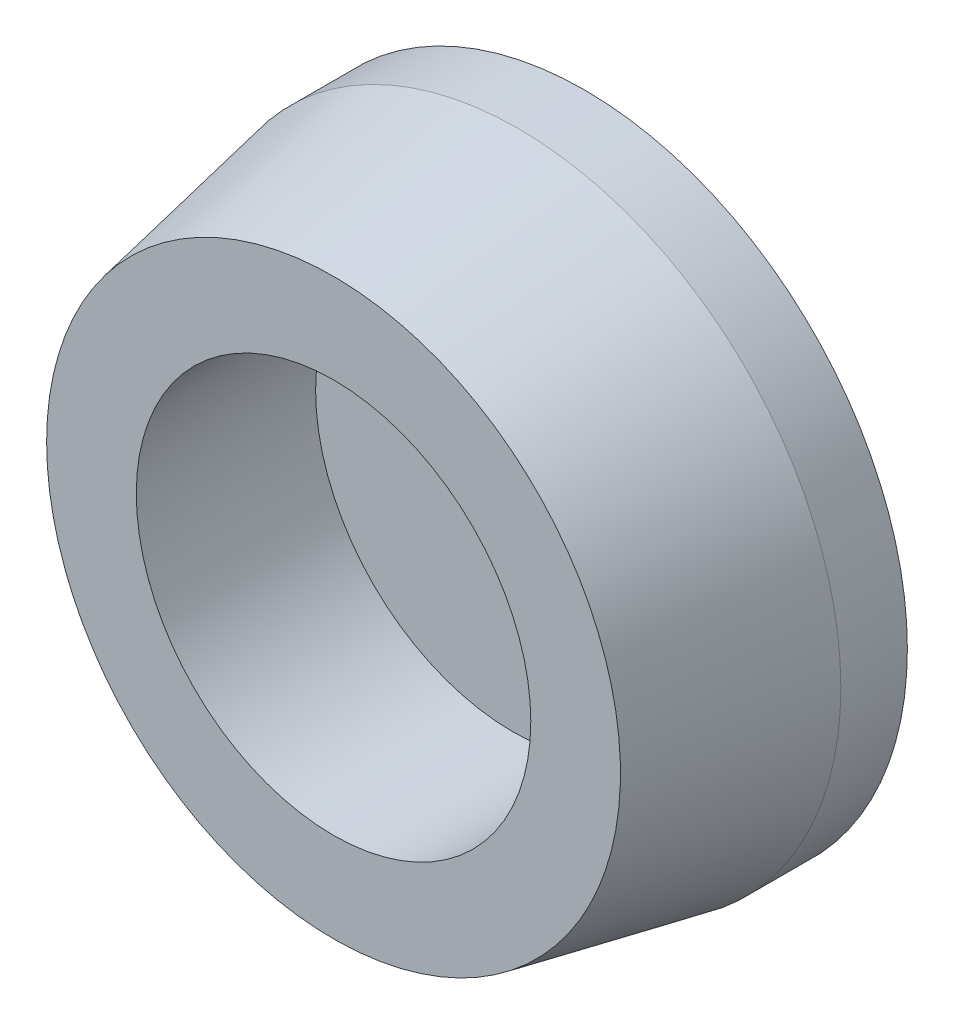
ISO-10303-21;
HEADER;
FILE_DESCRIPTION(('STEP AP214'),'2;1');
FILE_NAME('part.step','',(''),(''),'','','');
FILE_SCHEMA(('AUTOMOTIVE_DESIGN { 1 0 10303 214 1 1 1 1 }'));
ENDSEC;
DATA;
#1=APPLICATION_CONTEXT('core data for automotive mechanical design processes');
#2=APPLICATION_PROTOCOL_DEFINITION('international standard','automotive_design',2000,#1);
#3=PRODUCT_CONTEXT('',#1,'mechanical');
#4=PRODUCT('Part','Part','',(#3));
#5=PRODUCT_RELATED_PRODUCT_CATEGORY('part','',(#4));
#6=PRODUCT_DEFINITION_FORMATION('','',#4);
#7=PRODUCT_DEFINITION_CONTEXT('part definition',#1,'design');
#8=PRODUCT_DEFINITION('design','',#6,#7);
#9=PRODUCT_DEFINITION_SHAPE('','',#8);
#10=(LENGTH_UNIT() NAMED_UNIT(*) SI_UNIT(.MILLI.,.METRE.));
#11=(NAMED_UNIT(*) PLANE_ANGLE_UNIT() SI_UNIT($,.RADIAN.));
#12=(NAMED_UNIT(*) SI_UNIT($,.STERADIAN.) SOLID_ANGLE_UNIT());
#13=UNCERTAINTY_MEASURE_WITH_UNIT(LENGTH_MEASURE(1.E-05),#10,'distance_accuracy_value','');
#14=(GEOMETRIC_REPRESENTATION_CONTEXT(3) GLOBAL_UNCERTAINTY_ASSIGNED_CONTEXT((#13)) GLOBAL_UNIT_ASSIGNED_CONTEXT((#10,
#11,#12)) REPRESENTATION_CONTEXT('',''));
#15=CARTESIAN_POINT('',(0.,0.,0.));
#16=DIRECTION('',(0.,0.,1.));
#17=DIRECTION('',(1.,0.,0.));
#18=AXIS2_PLACEMENT_3D('',#15,#16,#17);
#19=CARTESIAN_POINT('',(0.,0.,7.));
#20=DIRECTION('',(0.,0.,-1.));
#21=DIRECTION('',(-1.,0.,0.));
#22=AXIS2_PLACEMENT_3D('',#19,#20,#21);
#23=CYLINDRICAL_SURFACE('',#22,9.);
#24=CARTESIAN_POINT('',(0.,0.,1.85544598402974));
#25=DIRECTION('',(0.,0.,1.));
#26=DIRECTION('',(1.,0.,0.));
#27=AXIS2_PLACEMENT_3D('',#24,#25,#26);
#28=CIRCLE('',#27,9.);
#29=CARTESIAN_POINT('',(-9.,0.,1.85544598402974));
#30=VERTEX_POINT('',#29);
#31=EDGE_CURVE('E10',#30,#30,#28,.F.);
#32=ORIENTED_EDGE('',*,*,#31,.T.);
#33=EDGE_LOOP('',(#32));
#34=FACE_BOUND('',#33,.T.);
#35=CARTESIAN_POINT('',(0.,0.,0.));
#36=DIRECTION('',(0.,0.,1.));
#37=DIRECTION('',(1.,0.,0.));
#38=AXIS2_PLACEMENT_3D('',#35,#36,#37);
#39=CIRCLE('',#38,9.);
#40=CARTESIAN_POINT('',(9.,0.,0.));
#41=VERTEX_POINT('',#40);
#42=EDGE_CURVE('E48',#41,#41,#39,.T.);
#43=ORIENTED_EDGE('',*,*,#42,.T.);
#44=EDGE_LOOP('',(#43));
#45=FACE_BOUND('',#44,.T.);
#46=ADVANCED_FACE('F36',(#34,#45),#23,.T.);
#47=CARTESIAN_POINT('',(0.,0.,7.));
#48=DIRECTION('',(0.,0.,1.));
#49=DIRECTION('',(1.,0.,0.));
#50=AXIS2_PLACEMENT_3D('',#47,#48,#49);
#51=PLANE('',#50);
#52=CARTESIAN_POINT('',(0.,0.,7.));
#53=DIRECTION('',(0.,0.,1.));
#54=DIRECTION('',(1.,0.,0.));
#55=AXIS2_PLACEMENT_3D('',#52,#53,#54);
#56=CIRCLE('',#55,8.);
#57=CARTESIAN_POINT('',(-8.,0.,7.));
#58=VERTEX_POINT('',#57);
#59=EDGE_CURVE('E44',#58,#58,#56,.T.);
#60=ORIENTED_EDGE('',*,*,#59,.T.);
#61=EDGE_LOOP('',(#60));
#62=FACE_BOUND('',#61,.T.);
#63=CARTESIAN_POINT('',(0.,0.,7.));
#64=DIRECTION('',(0.,0.,1.));
#65=DIRECTION('',(1.,0.,0.));
#66=AXIS2_PLACEMENT_3D('',#63,#64,#65);
#67=CIRCLE('',#66,5.5);
#68=CARTESIAN_POINT('',(5.5,0.,7.));
#69=VERTEX_POINT('',#68);
#70=EDGE_CURVE('E55',#69,#69,#67,.T.);
#71=ORIENTED_EDGE('',*,*,#70,.F.);
#72=EDGE_LOOP('',(#71));
#73=FACE_BOUND('',#72,.T.);
#74=ADVANCED_FACE('F70',(#62,#73),#51,.T.);
#75=CARTESIAN_POINT('',(0.,0.,0.));
#76=DIRECTION('',(0.,0.,1.));
#77=DIRECTION('',(1.,0.,0.));
#78=AXIS2_PLACEMENT_3D('',#75,#76,#77);
#79=PLANE('',#78);
#80=ORIENTED_EDGE('',*,*,#42,.F.);
#81=EDGE_LOOP('',(#80));
#82=FACE_BOUND('',#81,.T.);
#83=ADVANCED_FACE('F66',(#82),#79,.F.);
#84=CARTESIAN_POINT('',(0.,0.,2.));
#85=DIRECTION('',(0.,0.,1.));
#86=DIRECTION('',(1.,0.,0.));
#87=AXIS2_PLACEMENT_3D('',#84,#85,#86);
#88=CYLINDRICAL_SURFACE('',#87,5.5);
#89=CARTESIAN_POINT('',(0.,0.,2.));
#90=DIRECTION('',(0.,0.,1.));
#91=DIRECTION('',(1.,0.,0.));
#92=AXIS2_PLACEMENT_3D('',#89,#90,#91);
#93=CIRCLE('',#92,5.5);
#94=CARTESIAN_POINT('',(5.5,0.,2.));
#95=VERTEX_POINT('',#94);
#96=EDGE_CURVE('E52',#95,#95,#93,.T.);
#97=ORIENTED_EDGE('',*,*,#96,.F.);
#98=EDGE_LOOP('',(#97));
#99=FACE_BOUND('',#98,.T.);
#100=ORIENTED_EDGE('',*,*,#70,.T.);
#101=EDGE_LOOP('',(#100));
#102=FACE_BOUND('',#101,.T.);
#103=ADVANCED_FACE('F63',(#99,#102),#88,.F.);
#104=CARTESIAN_POINT('',(0.,0.,2.));
#105=DIRECTION('',(0.,0.,1.));
#106=DIRECTION('',(1.,0.,0.));
#107=AXIS2_PLACEMENT_3D('',#104,#105,#106);
#108=PLANE('',#107);
#109=ORIENTED_EDGE('',*,*,#96,.T.);
#110=EDGE_LOOP('',(#109));
#111=FACE_BOUND('',#110,.T.);
#112=ADVANCED_FACE('F61',(#111),#108,.T.);
#113=CARTESIAN_POINT('',(0.,0.,7.));
#114=DIRECTION('',(0.,0.,-1.));
#115=DIRECTION('',(-1.,0.,0.));
#116=AXIS2_PLACEMENT_3D('',#113,#114,#115);
#117=CONICAL_SURFACE('',#116,8.,0.191986217719377);
#118=CARTESIAN_POINT('',(-9.,0.,1.85544598402974));
#119=CARTESIAN_POINT('',(-8.98958333333333,0.,1.90903508836276));
#120=CARTESIAN_POINT('',(-8.97916666666667,0.,1.96262419269578));
#121=CARTESIAN_POINT('',(-8.95833333333333,0.,2.06980240136183));
#122=CARTESIAN_POINT('',(-8.94791666666667,0.,2.12339150569486));
#123=CARTESIAN_POINT('',(-8.92708333333333,0.,2.2305697143609));
#124=CARTESIAN_POINT('',(-8.91666666666666,0.,2.28415881869393));
#125=CARTESIAN_POINT('',(-8.89583333333333,0.,2.39133702735997));
#126=CARTESIAN_POINT('',(-8.88541666666667,0.,2.444926131693));
#127=CARTESIAN_POINT('',(-8.86458333333334,0.,2.55210434035904));
#128=CARTESIAN_POINT('',(-8.85416666666667,0.,2.60569344469207));
#129=CARTESIAN_POINT('',(-8.83333333333333,0.,2.71287165335811));
#130=CARTESIAN_POINT('',(-8.82291666666667,0.,2.76646075769114));
#131=CARTESIAN_POINT('',(-8.80208333333333,0.,2.87363896635718));
#132=CARTESIAN_POINT('',(-8.79166666666667,0.,2.92722807069021));
#133=CARTESIAN_POINT('',(-8.77083333333333,0.,3.03440627935626));
#134=CARTESIAN_POINT('',(-8.76041666666667,0.,3.08799538368928));
#135=CARTESIAN_POINT('',(-8.73958333333333,0.,3.19517359235533));
#136=CARTESIAN_POINT('',(-8.72916666666667,0.,3.24876269668835));
#137=CARTESIAN_POINT('',(-8.70833333333333,0.,3.3559409053544));
#138=CARTESIAN_POINT('',(-8.69791666666667,0.,3.40953000968742));
#139=CARTESIAN_POINT('',(-8.67708333333333,0.,3.51670821835347));
#140=CARTESIAN_POINT('',(-8.66666666666667,0.,3.57029732268649));
#141=CARTESIAN_POINT('',(-8.64583333333333,0.,3.67747553135254));
#142=CARTESIAN_POINT('',(-8.63541666666667,0.,3.73106463568556));
#143=CARTESIAN_POINT('',(-8.61458333333333,0.,3.83824284435161));
#144=CARTESIAN_POINT('',(-8.60416666666667,0.,3.89183194868463));
#145=CARTESIAN_POINT('',(-8.58333333333333,0.,3.99901015735068));
#146=CARTESIAN_POINT('',(-8.57291666666667,0.,4.0525992616837));
#147=CARTESIAN_POINT('',(-8.55208333333333,0.,4.15977747034975));
#148=CARTESIAN_POINT('',(-8.54166666666667,0.,4.21336657468277));
#149=CARTESIAN_POINT('',(-8.52083333333334,0.,4.32054478334882));
#150=CARTESIAN_POINT('',(-8.51041666666667,0.,4.37413388768184));
#151=CARTESIAN_POINT('',(-8.48958333333334,0.,4.48131209634789));
#152=CARTESIAN_POINT('',(-8.47916666666667,0.,4.53490120068092));
#153=CARTESIAN_POINT('',(-8.45833333333334,0.,4.64207940934696));
#154=CARTESIAN_POINT('',(-8.44791666666667,0.,4.69566851367999));
#155=CARTESIAN_POINT('',(-8.42708333333334,0.,4.80284672234603));
#156=CARTESIAN_POINT('',(-8.41666666666667,0.,4.85643582667906));
#157=CARTESIAN_POINT('',(-8.39583333333334,0.,4.9636140353451));
#158=CARTESIAN_POINT('',(-8.38541666666667,0.,5.01720313967813));
#159=CARTESIAN_POINT('',(-8.36458333333334,0.,5.12438134834417));
#160=CARTESIAN_POINT('',(-8.35416666666667,0.,5.1779704526772));
#161=CARTESIAN_POINT('',(-8.33333333333334,0.,5.28514866134325));
#162=CARTESIAN_POINT('',(-8.32291666666667,0.,5.33873776567627));
#163=CARTESIAN_POINT('',(-8.30208333333334,0.,5.44591597434232));
#164=CARTESIAN_POINT('',(-8.29166666666667,0.,5.49950507867534));
#165=CARTESIAN_POINT('',(-8.27083333333334,0.,5.60668328734139));
#166=CARTESIAN_POINT('',(-8.26041666666667,0.,5.66027239167441));
#167=CARTESIAN_POINT('',(-8.23958333333334,0.,5.76745060034046));
#168=CARTESIAN_POINT('',(-8.22916666666667,0.,5.82103970467348));
#169=CARTESIAN_POINT('',(-8.20833333333334,0.,5.92821791333953));
#170=CARTESIAN_POINT('',(-8.19791666666667,0.,5.98180701767255));
#171=CARTESIAN_POINT('',(-8.17708333333334,0.,6.0889852263386));
#172=CARTESIAN_POINT('',(-8.16666666666667,0.,6.14257433067162));
#173=CARTESIAN_POINT('',(-8.14583333333334,0.,6.24975253933767));
#174=CARTESIAN_POINT('',(-8.13541666666667,0.,6.30334164367069));
#175=CARTESIAN_POINT('',(-8.11458333333334,0.,6.41051985233674));
#176=CARTESIAN_POINT('',(-8.10416666666667,0.,6.46410895666976));
#177=CARTESIAN_POINT('',(-8.08333333333334,0.,6.57128716533581));
#178=CARTESIAN_POINT('',(-8.07291666666667,0.,6.62487626966884));
#179=CARTESIAN_POINT('',(-8.05208333333334,0.,6.73205447833488));
#180=CARTESIAN_POINT('',(-8.04166666666667,0.,6.78564358266791));
#181=CARTESIAN_POINT('',(-8.02083333333334,0.,6.89282179133395));
#182=CARTESIAN_POINT('',(-8.01041666666667,0.,6.94641089566698));
#183=CARTESIAN_POINT('',(-8.,0.,7.));
#184=B_SPLINE_CURVE_WITH_KNOTS('',3,(#118,#119,#120,#121,#122,#123,#124,#125,#126,#127,#128,
#129,#130,#131,#132,#133,#134,#135,#136,#137,#138,#139,#140,#141,#142,#143,#144,#145,#146,#147,
#148,#149,#150,#151,#152,#153,#154,#155,#156,#157,#158,#159,#160,#161,#162,#163,#164,#165,#166,
#167,#168,#169,#170,#171,#172,#173,#174,#175,#176,#177,#178,#179,#180,#181,#182,#183),
.UNSPECIFIED.,.F.,.F.,(4,2,2,2,2,2,2,2,2,2,2,2,2,2,2,2,2,2,2,2,2,2,2,2,2,2,2,2,2,2,2,2,4),(0.,
0.163776345755244,0.327552691510488,0.491329037265732,0.655105383020975,0.818881728776219,
0.982658074531463,1.14643442028671,1.31021076604195,1.47398711179719,1.63776345755244,
1.80153980330768,1.96531614906293,2.12909249481817,2.29286884057341,2.45664518632866,
2.6204215320839,2.78419787783915,2.94797422359439,3.11175056934963,3.27552691510488,
3.43930326086012,3.60307960661537,3.76685595237061,3.93063229812585,4.0944086438811,
4.25818498963634,4.42196133539158,4.58573768114683,4.74951402690207,4.91329037265731,
5.07706671841256,5.2408430641678),.UNSPECIFIED.);
#185=EDGE_CURVE('BSEAM39',#30,#58,#184,.T.);
#186=ORIENTED_EDGE('',*,*,#31,.F.);
#187=ORIENTED_EDGE('',*,*,#59,.F.);
#188=ORIENTED_EDGE('',*,*,#185,.T.);
#189=ORIENTED_EDGE('',*,*,#185,.F.);
#190=EDGE_LOOP('',(#186,#188,#187,#189));
#191=FACE_BOUND('',#190,.T.);
#192=ADVANCED_FACE('F39',(#191),#117,.T.);
#193=CLOSED_SHELL('',(#46,#74,#83,#103,#112,#192));
#194=MANIFOLD_SOLID_BREP('B2',#193);
#195=ADVANCED_BREP_SHAPE_REPRESENTATION('',(#18,#194),#14);
#196=SHAPE_DEFINITION_REPRESENTATION(#9,#195);
ENDSEC;
END-ISO-10303-21;
